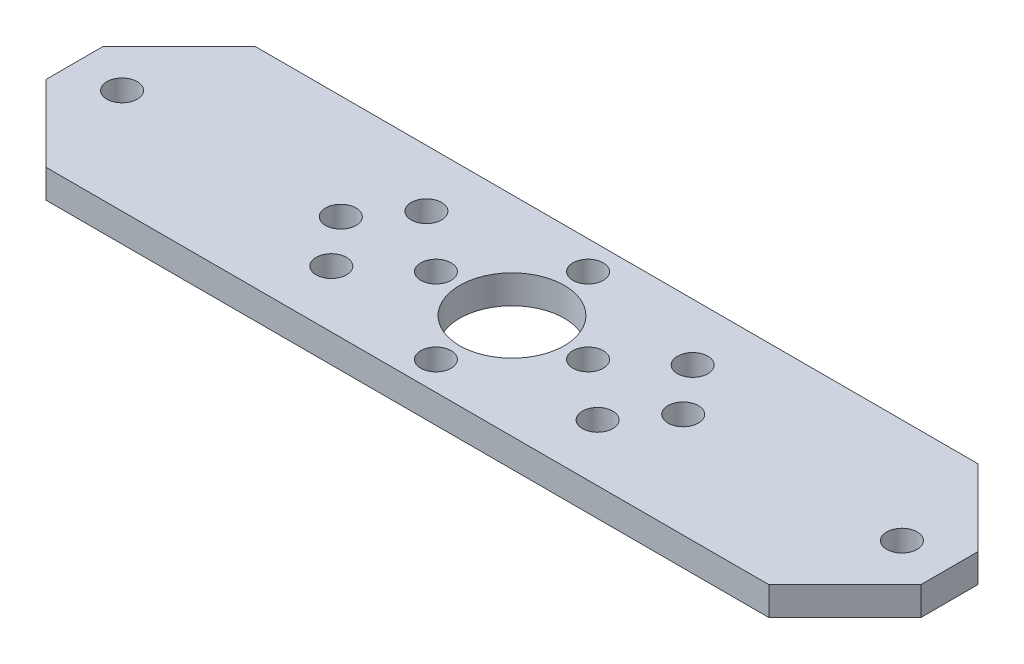
ISO-10303-21;
HEADER;
FILE_DESCRIPTION(('STEP AP214'),'2;1');
FILE_NAME('part.step','',(''),(''),'','','');
FILE_SCHEMA(('AUTOMOTIVE_DESIGN { 1 0 10303 214 1 1 1 1 }'));
ENDSEC;
DATA;
#1=APPLICATION_CONTEXT('core data for automotive mechanical design processes');
#2=APPLICATION_PROTOCOL_DEFINITION('international standard','automotive_design',2000,#1);
#3=PRODUCT_CONTEXT('',#1,'mechanical');
#4=PRODUCT('Part','Part','',(#3));
#5=PRODUCT_RELATED_PRODUCT_CATEGORY('part','',(#4));
#6=PRODUCT_DEFINITION_FORMATION('','',#4);
#7=PRODUCT_DEFINITION_CONTEXT('part definition',#1,'design');
#8=PRODUCT_DEFINITION('design','',#6,#7);
#9=PRODUCT_DEFINITION_SHAPE('','',#8);
#10=(LENGTH_UNIT() NAMED_UNIT(*) SI_UNIT(.MILLI.,.METRE.));
#11=(NAMED_UNIT(*) PLANE_ANGLE_UNIT() SI_UNIT($,.RADIAN.));
#12=(NAMED_UNIT(*) SI_UNIT($,.STERADIAN.) SOLID_ANGLE_UNIT());
#13=UNCERTAINTY_MEASURE_WITH_UNIT(LENGTH_MEASURE(1.E-05),#10,'distance_accuracy_value','');
#14=(GEOMETRIC_REPRESENTATION_CONTEXT(3) GLOBAL_UNCERTAINTY_ASSIGNED_CONTEXT((#13)) GLOBAL_UNIT_ASSIGNED_CONTEXT((#10,
#11,#12)) REPRESENTATION_CONTEXT('',''));
#15=CARTESIAN_POINT('',(0.,0.,0.));
#16=DIRECTION('',(0.,0.,1.));
#17=DIRECTION('',(1.,0.,0.));
#18=AXIS2_PLACEMENT_3D('',#15,#16,#17);
#19=CARTESIAN_POINT('',(0.,3.,0.));
#20=DIRECTION('',(0.,-1.,0.));
#21=DIRECTION('',(0.,0.,-1.));
#22=AXIS2_PLACEMENT_3D('',#19,#20,#21);
#23=PLANE('',#22);
#24=DIRECTION('',(0.,0.,1.));
#25=VECTOR('',#24,1.);
#26=CARTESIAN_POINT('',(-46.,3.,3.));
#27=LINE('',#26,#25);
#28=CARTESIAN_POINT('',(-46.,3.,-3.));
#29=VERTEX_POINT('',#28);
#30=CARTESIAN_POINT('',(-46.,3.,3.));
#31=VERTEX_POINT('',#30);
#32=EDGE_CURVE('E172',#29,#31,#27,.T.);
#33=ORIENTED_EDGE('',*,*,#32,.T.);
#34=DIRECTION('',(0.707106781186548,0.,0.707106781186548));
#35=VECTOR('',#34,1.);
#36=CARTESIAN_POINT('',(-46.,3.,3.));
#37=LINE('',#36,#35);
#38=CARTESIAN_POINT('',(-38.,3.,11.));
#39=VERTEX_POINT('',#38);
#40=EDGE_CURVE('E106',#31,#39,#37,.T.);
#41=ORIENTED_EDGE('',*,*,#40,.T.);
#42=DIRECTION('',(1.,0.,0.));
#43=VECTOR('',#42,1.);
#44=CARTESIAN_POINT('',(-38.,3.,11.));
#45=LINE('',#44,#43);
#46=CARTESIAN_POINT('',(38.,3.,11.));
#47=VERTEX_POINT('',#46);
#48=EDGE_CURVE('E194',#39,#47,#45,.T.);
#49=ORIENTED_EDGE('',*,*,#48,.T.);
#50=DIRECTION('',(0.707106781186548,0.,-0.707106781186548));
#51=VECTOR('',#50,1.);
#52=CARTESIAN_POINT('',(38.,3.,11.));
#53=LINE('',#52,#51);
#54=CARTESIAN_POINT('',(46.,3.,3.));
#55=VERTEX_POINT('',#54);
#56=EDGE_CURVE('E208',#47,#55,#53,.T.);
#57=ORIENTED_EDGE('',*,*,#56,.T.);
#58=DIRECTION('',(0.,0.,-1.));
#59=VECTOR('',#58,1.);
#60=CARTESIAN_POINT('',(46.,3.,3.));
#61=LINE('',#60,#59);
#62=CARTESIAN_POINT('',(46.,3.,-3.));
#63=VERTEX_POINT('',#62);
#64=EDGE_CURVE('E125',#55,#63,#61,.T.);
#65=ORIENTED_EDGE('',*,*,#64,.T.);
#66=DIRECTION('',(-0.707106781186548,0.,-0.707106781186548));
#67=VECTOR('',#66,1.);
#68=CARTESIAN_POINT('',(38.,3.,-11.));
#69=LINE('',#68,#67);
#70=CARTESIAN_POINT('',(38.,3.,-11.));
#71=VERTEX_POINT('',#70);
#72=EDGE_CURVE('E119',#63,#71,#69,.T.);
#73=ORIENTED_EDGE('',*,*,#72,.T.);
#74=DIRECTION('',(-1.,0.,0.));
#75=VECTOR('',#74,1.);
#76=CARTESIAN_POINT('',(-38.,3.,-11.));
#77=LINE('',#76,#75);
#78=CARTESIAN_POINT('',(-38.,3.,-11.));
#79=VERTEX_POINT('',#78);
#80=EDGE_CURVE('E123',#71,#79,#77,.T.);
#81=ORIENTED_EDGE('',*,*,#80,.T.);
#82=DIRECTION('',(-0.707106781186548,0.,0.707106781186548));
#83=VECTOR('',#82,1.);
#84=CARTESIAN_POINT('',(-46.,3.,-3.));
#85=LINE('',#84,#83);
#86=EDGE_CURVE('E63',#79,#29,#85,.T.);
#87=ORIENTED_EDGE('',*,*,#86,.T.);
#88=EDGE_LOOP('',(#33,#41,#49,#57,#65,#73,#81,#87));
#89=FACE_BOUND('',#88,.T.);
#90=CARTESIAN_POINT('',(0.,3.,8.));
#91=DIRECTION('',(0.,1.,0.));
#92=DIRECTION('',(0.,0.,-1.));
#93=AXIS2_PLACEMENT_3D('',#90,#91,#92);
#94=CIRCLE('',#93,1.6);
#95=CARTESIAN_POINT('',(0.,3.,6.4));
#96=VERTEX_POINT('',#95);
#97=EDGE_CURVE('E154',#96,#96,#94,.T.);
#98=ORIENTED_EDGE('',*,*,#97,.F.);
#99=EDGE_LOOP('',(#98));
#100=FACE_BOUND('',#99,.T.);
#101=CARTESIAN_POINT('',(0.,3.,-8.));
#102=DIRECTION('',(0.,1.,0.));
#103=DIRECTION('',(0.,0.,1.));
#104=AXIS2_PLACEMENT_3D('',#101,#102,#103);
#105=CIRCLE('',#104,1.6);
#106=CARTESIAN_POINT('',(0.,3.,-6.4));
#107=VERTEX_POINT('',#106);
#108=EDGE_CURVE('E223',#107,#107,#105,.T.);
#109=ORIENTED_EDGE('',*,*,#108,.F.);
#110=EDGE_LOOP('',(#109));
#111=FACE_BOUND('',#110,.T.);
#112=CARTESIAN_POINT('',(8.,3.,0.));
#113=DIRECTION('',(0.,1.,0.));
#114=DIRECTION('',(0.,0.,1.));
#115=AXIS2_PLACEMENT_3D('',#112,#113,#114);
#116=CIRCLE('',#115,1.6);
#117=CARTESIAN_POINT('',(8.,3.,1.6));
#118=VERTEX_POINT('',#117);
#119=EDGE_CURVE('E231',#118,#118,#116,.T.);
#120=ORIENTED_EDGE('',*,*,#119,.F.);
#121=EDGE_LOOP('',(#120));
#122=FACE_BOUND('',#121,.T.);
#123=CARTESIAN_POINT('',(-8.,3.,0.));
#124=DIRECTION('',(0.,1.,0.));
#125=DIRECTION('',(0.,0.,-1.));
#126=AXIS2_PLACEMENT_3D('',#123,#124,#125);
#127=CIRCLE('',#126,1.6);
#128=CARTESIAN_POINT('',(-8.,3.,-1.6));
#129=VERTEX_POINT('',#128);
#130=EDGE_CURVE('E238',#129,#129,#127,.T.);
#131=ORIENTED_EDGE('',*,*,#130,.F.);
#132=EDGE_LOOP('',(#131));
#133=FACE_BOUND('',#132,.T.);
#134=CARTESIAN_POINT('',(-18.,3.,0.));
#135=DIRECTION('',(0.,1.,0.));
#136=DIRECTION('',(0.,0.,1.));
#137=AXIS2_PLACEMENT_3D('',#134,#135,#136);
#138=CIRCLE('',#137,1.60000000000001);
#139=CARTESIAN_POINT('',(-18.,3.,1.60000000000001));
#140=VERTEX_POINT('',#139);
#141=EDGE_CURVE('E245',#140,#140,#138,.T.);
#142=ORIENTED_EDGE('',*,*,#141,.F.);
#143=EDGE_LOOP('',(#142));
#144=FACE_BOUND('',#143,.T.);
#145=CARTESIAN_POINT('',(-14.,3.,-5.));
#146=DIRECTION('',(0.,1.,0.));
#147=DIRECTION('',(0.,0.,1.));
#148=AXIS2_PLACEMENT_3D('',#145,#146,#147);
#149=CIRCLE('',#148,1.6);
#150=CARTESIAN_POINT('',(-14.,3.,-3.4));
#151=VERTEX_POINT('',#150);
#152=EDGE_CURVE('E253',#151,#151,#149,.T.);
#153=ORIENTED_EDGE('',*,*,#152,.F.);
#154=EDGE_LOOP('',(#153));
#155=FACE_BOUND('',#154,.T.);
#156=CARTESIAN_POINT('',(-14.,3.,5.));
#157=DIRECTION('',(0.,1.,0.));
#158=DIRECTION('',(0.,0.,-1.));
#159=AXIS2_PLACEMENT_3D('',#156,#157,#158);
#160=CIRCLE('',#159,1.6);
#161=CARTESIAN_POINT('',(-14.,3.,3.4));
#162=VERTEX_POINT('',#161);
#163=EDGE_CURVE('E261',#162,#162,#160,.T.);
#164=ORIENTED_EDGE('',*,*,#163,.F.);
#165=EDGE_LOOP('',(#164));
#166=FACE_BOUND('',#165,.T.);
#167=CARTESIAN_POINT('',(14.,3.,5.));
#168=DIRECTION('',(0.,1.,0.));
#169=DIRECTION('',(0.,0.,1.));
#170=AXIS2_PLACEMENT_3D('',#167,#168,#169);
#171=CIRCLE('',#170,1.60000000000001);
#172=CARTESIAN_POINT('',(14.,3.,6.6));
#173=VERTEX_POINT('',#172);
#174=EDGE_CURVE('E269',#173,#173,#171,.T.);
#175=ORIENTED_EDGE('',*,*,#174,.F.);
#176=EDGE_LOOP('',(#175));
#177=FACE_BOUND('',#176,.T.);
#178=CARTESIAN_POINT('',(18.,3.,0.));
#179=DIRECTION('',(0.,1.,0.));
#180=DIRECTION('',(0.,0.,-1.));
#181=AXIS2_PLACEMENT_3D('',#178,#179,#180);
#182=CIRCLE('',#181,1.60000000000001);
#183=CARTESIAN_POINT('',(18.,3.,-1.60000000000001));
#184=VERTEX_POINT('',#183);
#185=EDGE_CURVE('E277',#184,#184,#182,.T.);
#186=ORIENTED_EDGE('',*,*,#185,.F.);
#187=EDGE_LOOP('',(#186));
#188=FACE_BOUND('',#187,.T.);
#189=CARTESIAN_POINT('',(14.,3.,-5.));
#190=DIRECTION('',(0.,1.,0.));
#191=DIRECTION('',(0.,0.,-1.));
#192=AXIS2_PLACEMENT_3D('',#189,#190,#191);
#193=CIRCLE('',#192,1.60000000000001);
#194=CARTESIAN_POINT('',(14.,3.,-6.6));
#195=VERTEX_POINT('',#194);
#196=EDGE_CURVE('E284',#195,#195,#193,.T.);
#197=ORIENTED_EDGE('',*,*,#196,.F.);
#198=EDGE_LOOP('',(#197));
#199=FACE_BOUND('',#198,.T.);
#200=CARTESIAN_POINT('',(-41.,3.,0.));
#201=DIRECTION('',(0.,1.,0.));
#202=DIRECTION('',(0.,0.,1.));
#203=AXIS2_PLACEMENT_3D('',#200,#201,#202);
#204=CIRCLE('',#203,1.6);
#205=CARTESIAN_POINT('',(-41.,3.,1.6));
#206=VERTEX_POINT('',#205);
#207=EDGE_CURVE('E291',#206,#206,#204,.T.);
#208=ORIENTED_EDGE('',*,*,#207,.F.);
#209=EDGE_LOOP('',(#208));
#210=FACE_BOUND('',#209,.T.);
#211=CARTESIAN_POINT('',(41.,3.,0.));
#212=DIRECTION('',(0.,1.,0.));
#213=DIRECTION('',(0.,0.,-1.));
#214=AXIS2_PLACEMENT_3D('',#211,#212,#213);
#215=CIRCLE('',#214,1.6);
#216=CARTESIAN_POINT('',(41.,3.,-1.6));
#217=VERTEX_POINT('',#216);
#218=EDGE_CURVE('E299',#217,#217,#215,.T.);
#219=ORIENTED_EDGE('',*,*,#218,.F.);
#220=EDGE_LOOP('',(#219));
#221=FACE_BOUND('',#220,.T.);
#222=CARTESIAN_POINT('',(0.,3.,0.));
#223=DIRECTION('',(0.,1.,0.));
#224=DIRECTION('',(0.,0.,1.));
#225=AXIS2_PLACEMENT_3D('',#222,#223,#224);
#226=CIRCLE('',#225,5.5);
#227=CARTESIAN_POINT('',(0.,3.,5.5));
#228=VERTEX_POINT('',#227);
#229=EDGE_CURVE('E307',#228,#228,#226,.T.);
#230=ORIENTED_EDGE('',*,*,#229,.F.);
#231=EDGE_LOOP('',(#230));
#232=FACE_BOUND('',#231,.T.);
#233=ADVANCED_FACE('F45',(#89,#100,#111,#122,#133,#144,#155,#166,#177,#188,#199,#210,#221,#232),
#23,.F.);
#234=CARTESIAN_POINT('',(0.,0.,0.));
#235=DIRECTION('',(0.,-1.,0.));
#236=DIRECTION('',(0.,0.,-1.));
#237=AXIS2_PLACEMENT_3D('',#234,#235,#236);
#238=PLANE('',#237);
#239=CARTESIAN_POINT('',(41.,0.,0.));
#240=DIRECTION('',(0.,1.,0.));
#241=DIRECTION('',(0.,0.,-1.));
#242=AXIS2_PLACEMENT_3D('',#239,#240,#241);
#243=CIRCLE('',#242,1.6);
#244=CARTESIAN_POINT('',(41.,0.,-1.6));
#245=VERTEX_POINT('',#244);
#246=EDGE_CURVE('E303',#245,#245,#243,.T.);
#247=ORIENTED_EDGE('',*,*,#246,.T.);
#248=EDGE_LOOP('',(#247));
#249=FACE_BOUND('',#248,.T.);
#250=CARTESIAN_POINT('',(14.,0.,-5.));
#251=DIRECTION('',(0.,1.,0.));
#252=DIRECTION('',(0.,0.,-1.));
#253=AXIS2_PLACEMENT_3D('',#250,#251,#252);
#254=CIRCLE('',#253,1.60000000000001);
#255=CARTESIAN_POINT('',(14.,0.,-6.6));
#256=VERTEX_POINT('',#255);
#257=EDGE_CURVE('E288',#256,#256,#254,.T.);
#258=ORIENTED_EDGE('',*,*,#257,.T.);
#259=EDGE_LOOP('',(#258));
#260=FACE_BOUND('',#259,.T.);
#261=CARTESIAN_POINT('',(14.,0.,5.));
#262=DIRECTION('',(0.,1.,0.));
#263=DIRECTION('',(0.,0.,1.));
#264=AXIS2_PLACEMENT_3D('',#261,#262,#263);
#265=CIRCLE('',#264,1.60000000000001);
#266=CARTESIAN_POINT('',(14.,0.,6.6));
#267=VERTEX_POINT('',#266);
#268=EDGE_CURVE('E273',#267,#267,#265,.T.);
#269=ORIENTED_EDGE('',*,*,#268,.T.);
#270=EDGE_LOOP('',(#269));
#271=FACE_BOUND('',#270,.T.);
#272=CARTESIAN_POINT('',(-14.,0.,-5.));
#273=DIRECTION('',(0.,1.,0.));
#274=DIRECTION('',(0.,0.,1.));
#275=AXIS2_PLACEMENT_3D('',#272,#273,#274);
#276=CIRCLE('',#275,1.6);
#277=CARTESIAN_POINT('',(-14.,0.,-3.4));
#278=VERTEX_POINT('',#277);
#279=EDGE_CURVE('E257',#278,#278,#276,.T.);
#280=ORIENTED_EDGE('',*,*,#279,.T.);
#281=EDGE_LOOP('',(#280));
#282=FACE_BOUND('',#281,.T.);
#283=CARTESIAN_POINT('',(-8.,0.,0.));
#284=DIRECTION('',(0.,1.,0.));
#285=DIRECTION('',(0.,0.,-1.));
#286=AXIS2_PLACEMENT_3D('',#283,#284,#285);
#287=CIRCLE('',#286,1.6);
#288=CARTESIAN_POINT('',(-8.,0.,-1.6));
#289=VERTEX_POINT('',#288);
#290=EDGE_CURVE('E241',#289,#289,#287,.T.);
#291=ORIENTED_EDGE('',*,*,#290,.T.);
#292=EDGE_LOOP('',(#291));
#293=FACE_BOUND('',#292,.T.);
#294=CARTESIAN_POINT('',(0.,0.,-8.));
#295=DIRECTION('',(0.,1.,0.));
#296=DIRECTION('',(0.,0.,1.));
#297=AXIS2_PLACEMENT_3D('',#294,#295,#296);
#298=CIRCLE('',#297,1.6);
#299=CARTESIAN_POINT('',(0.,0.,-6.4));
#300=VERTEX_POINT('',#299);
#301=EDGE_CURVE('E227',#300,#300,#298,.T.);
#302=ORIENTED_EDGE('',*,*,#301,.T.);
#303=EDGE_LOOP('',(#302));
#304=FACE_BOUND('',#303,.T.);
#305=DIRECTION('',(0.,0.,1.));
#306=VECTOR('',#305,1.);
#307=CARTESIAN_POINT('',(-46.,0.,3.));
#308=LINE('',#307,#306);
#309=CARTESIAN_POINT('',(-46.,0.,-3.));
#310=VERTEX_POINT('',#309);
#311=CARTESIAN_POINT('',(-46.,0.,3.));
#312=VERTEX_POINT('',#311);
#313=EDGE_CURVE('E149',#310,#312,#308,.T.);
#314=ORIENTED_EDGE('',*,*,#313,.F.);
#315=DIRECTION('',(-0.707106781186548,0.,0.707106781186548));
#316=VECTOR('',#315,1.);
#317=CARTESIAN_POINT('',(-46.,0.,-3.));
#318=LINE('',#317,#316);
#319=CARTESIAN_POINT('',(-38.,0.,-11.));
#320=VERTEX_POINT('',#319);
#321=EDGE_CURVE('E98',#320,#310,#318,.T.);
#322=ORIENTED_EDGE('',*,*,#321,.F.);
#323=DIRECTION('',(-1.,0.,0.));
#324=VECTOR('',#323,1.);
#325=CARTESIAN_POINT('',(-38.,0.,-11.));
#326=LINE('',#325,#324);
#327=CARTESIAN_POINT('',(38.,0.,-11.));
#328=VERTEX_POINT('',#327);
#329=EDGE_CURVE('E92',#328,#320,#326,.T.);
#330=ORIENTED_EDGE('',*,*,#329,.F.);
#331=DIRECTION('',(-0.707106781186548,0.,-0.707106781186548));
#332=VECTOR('',#331,1.);
#333=CARTESIAN_POINT('',(38.,0.,-11.));
#334=LINE('',#333,#332);
#335=CARTESIAN_POINT('',(46.,0.,-3.));
#336=VERTEX_POINT('',#335);
#337=EDGE_CURVE('E134',#336,#328,#334,.T.);
#338=ORIENTED_EDGE('',*,*,#337,.F.);
#339=DIRECTION('',(0.,0.,-1.));
#340=VECTOR('',#339,1.);
#341=CARTESIAN_POINT('',(46.,0.,3.));
#342=LINE('',#341,#340);
#343=CARTESIAN_POINT('',(46.,0.,3.));
#344=VERTEX_POINT('',#343);
#345=EDGE_CURVE('E163',#344,#336,#342,.T.);
#346=ORIENTED_EDGE('',*,*,#345,.F.);
#347=DIRECTION('',(0.707106781186548,0.,-0.707106781186548));
#348=VECTOR('',#347,1.);
#349=CARTESIAN_POINT('',(38.,0.,11.));
#350=LINE('',#349,#348);
#351=CARTESIAN_POINT('',(38.,0.,11.));
#352=VERTEX_POINT('',#351);
#353=EDGE_CURVE('E160',#352,#344,#350,.T.);
#354=ORIENTED_EDGE('',*,*,#353,.F.);
#355=DIRECTION('',(1.,0.,0.));
#356=VECTOR('',#355,1.);
#357=CARTESIAN_POINT('',(-38.,0.,11.));
#358=LINE('',#357,#356);
#359=CARTESIAN_POINT('',(-38.,0.,11.));
#360=VERTEX_POINT('',#359);
#361=EDGE_CURVE('E157',#360,#352,#358,.T.);
#362=ORIENTED_EDGE('',*,*,#361,.F.);
#363=DIRECTION('',(0.707106781186548,0.,0.707106781186548));
#364=VECTOR('',#363,1.);
#365=CARTESIAN_POINT('',(-46.,0.,3.));
#366=LINE('',#365,#364);
#367=EDGE_CURVE('E153',#312,#360,#366,.T.);
#368=ORIENTED_EDGE('',*,*,#367,.F.);
#369=EDGE_LOOP('',(#314,#322,#330,#338,#346,#354,#362,#368));
#370=FACE_BOUND('',#369,.T.);
#371=CARTESIAN_POINT('',(0.,0.,8.));
#372=DIRECTION('',(0.,1.,0.));
#373=DIRECTION('',(0.,0.,-1.));
#374=AXIS2_PLACEMENT_3D('',#371,#372,#373);
#375=CIRCLE('',#374,1.6);
#376=CARTESIAN_POINT('',(0.,0.,6.4));
#377=VERTEX_POINT('',#376);
#378=EDGE_CURVE('E219',#377,#377,#375,.T.);
#379=ORIENTED_EDGE('',*,*,#378,.T.);
#380=EDGE_LOOP('',(#379));
#381=FACE_BOUND('',#380,.T.);
#382=CARTESIAN_POINT('',(8.,0.,0.));
#383=DIRECTION('',(0.,1.,0.));
#384=DIRECTION('',(0.,0.,1.));
#385=AXIS2_PLACEMENT_3D('',#382,#383,#384);
#386=CIRCLE('',#385,1.6);
#387=CARTESIAN_POINT('',(8.,0.,1.6));
#388=VERTEX_POINT('',#387);
#389=EDGE_CURVE('E235',#388,#388,#386,.T.);
#390=ORIENTED_EDGE('',*,*,#389,.T.);
#391=EDGE_LOOP('',(#390));
#392=FACE_BOUND('',#391,.T.);
#393=CARTESIAN_POINT('',(-18.,0.,0.));
#394=DIRECTION('',(0.,1.,0.));
#395=DIRECTION('',(0.,0.,1.));
#396=AXIS2_PLACEMENT_3D('',#393,#394,#395);
#397=CIRCLE('',#396,1.60000000000001);
#398=CARTESIAN_POINT('',(-18.,0.,1.60000000000001));
#399=VERTEX_POINT('',#398);
#400=EDGE_CURVE('E249',#399,#399,#397,.T.);
#401=ORIENTED_EDGE('',*,*,#400,.T.);
#402=EDGE_LOOP('',(#401));
#403=FACE_BOUND('',#402,.T.);
#404=CARTESIAN_POINT('',(-14.,0.,5.));
#405=DIRECTION('',(0.,1.,0.));
#406=DIRECTION('',(0.,0.,-1.));
#407=AXIS2_PLACEMENT_3D('',#404,#405,#406);
#408=CIRCLE('',#407,1.6);
#409=CARTESIAN_POINT('',(-14.,0.,3.4));
#410=VERTEX_POINT('',#409);
#411=EDGE_CURVE('E265',#410,#410,#408,.T.);
#412=ORIENTED_EDGE('',*,*,#411,.T.);
#413=EDGE_LOOP('',(#412));
#414=FACE_BOUND('',#413,.T.);
#415=CARTESIAN_POINT('',(18.,0.,0.));
#416=DIRECTION('',(0.,1.,0.));
#417=DIRECTION('',(0.,0.,-1.));
#418=AXIS2_PLACEMENT_3D('',#415,#416,#417);
#419=CIRCLE('',#418,1.60000000000001);
#420=CARTESIAN_POINT('',(18.,0.,-1.60000000000001));
#421=VERTEX_POINT('',#420);
#422=EDGE_CURVE('E280',#421,#421,#419,.T.);
#423=ORIENTED_EDGE('',*,*,#422,.T.);
#424=EDGE_LOOP('',(#423));
#425=FACE_BOUND('',#424,.T.);
#426=CARTESIAN_POINT('',(-41.,0.,0.));
#427=DIRECTION('',(0.,1.,0.));
#428=DIRECTION('',(0.,0.,1.));
#429=AXIS2_PLACEMENT_3D('',#426,#427,#428);
#430=CIRCLE('',#429,1.6);
#431=CARTESIAN_POINT('',(-41.,0.,1.6));
#432=VERTEX_POINT('',#431);
#433=EDGE_CURVE('E295',#432,#432,#430,.T.);
#434=ORIENTED_EDGE('',*,*,#433,.T.);
#435=EDGE_LOOP('',(#434));
#436=FACE_BOUND('',#435,.T.);
#437=CARTESIAN_POINT('',(0.,0.,0.));
#438=DIRECTION('',(0.,1.,0.));
#439=DIRECTION('',(0.,0.,1.));
#440=AXIS2_PLACEMENT_3D('',#437,#438,#439);
#441=CIRCLE('',#440,5.5);
#442=CARTESIAN_POINT('',(0.,0.,5.5));
#443=VERTEX_POINT('',#442);
#444=EDGE_CURVE('E311',#443,#443,#441,.T.);
#445=ORIENTED_EDGE('',*,*,#444,.T.);
#446=EDGE_LOOP('',(#445));
#447=FACE_BOUND('',#446,.T.);
#448=ADVANCED_FACE('F198',(#249,#260,#271,#282,#293,#304,#370,#381,#392,#403,#414,#425,#436,
#447),#238,.T.);
#449=CARTESIAN_POINT('',(-46.,3.,3.));
#450=DIRECTION('',(1.,0.,0.));
#451=DIRECTION('',(0.,0.,-1.));
#452=AXIS2_PLACEMENT_3D('',#449,#450,#451);
#453=PLANE('',#452);
#454=ORIENTED_EDGE('',*,*,#313,.T.);
#455=DIRECTION('',(0.,-1.,0.));
#456=VECTOR('',#455,1.);
#457=CARTESIAN_POINT('',(-46.,3.,3.));
#458=LINE('',#457,#456);
#459=EDGE_CURVE('E11',#31,#312,#458,.T.);
#460=ORIENTED_EDGE('',*,*,#459,.F.);
#461=ORIENTED_EDGE('',*,*,#32,.F.);
#462=DIRECTION('',(0.,-1.,0.));
#463=VECTOR('',#462,1.);
#464=CARTESIAN_POINT('',(-46.,3.,-3.));
#465=LINE('',#464,#463);
#466=EDGE_CURVE('E145',#29,#310,#465,.T.);
#467=ORIENTED_EDGE('',*,*,#466,.T.);
#468=EDGE_LOOP('',(#454,#460,#461,#467));
#469=FACE_BOUND('',#468,.T.);
#470=ADVANCED_FACE('F47',(#469),#453,.F.);
#471=CARTESIAN_POINT('',(-46.,3.,3.));
#472=DIRECTION('',(0.707106781186547,0.,-0.707106781186547));
#473=DIRECTION('',(-0.707106781186548,0.,-0.707106781186548));
#474=AXIS2_PLACEMENT_3D('',#471,#472,#473);
#475=PLANE('',#474);
#476=ORIENTED_EDGE('',*,*,#367,.T.);
#477=DIRECTION('',(0.,-1.,0.));
#478=VECTOR('',#477,1.);
#479=CARTESIAN_POINT('',(-38.,3.,11.));
#480=LINE('',#479,#478);
#481=EDGE_CURVE('E55',#39,#360,#480,.T.);
#482=ORIENTED_EDGE('',*,*,#481,.F.);
#483=ORIENTED_EDGE('',*,*,#40,.F.);
#484=ORIENTED_EDGE('',*,*,#459,.T.);
#485=EDGE_LOOP('',(#476,#482,#483,#484));
#486=FACE_BOUND('',#485,.T.);
#487=ADVANCED_FACE('F344',(#486),#475,.F.);
#488=CARTESIAN_POINT('',(-38.,3.,11.));
#489=DIRECTION('',(0.,0.,-1.));
#490=DIRECTION('',(-1.,0.,0.));
#491=AXIS2_PLACEMENT_3D('',#488,#489,#490);
#492=PLANE('',#491);
#493=ORIENTED_EDGE('',*,*,#361,.T.);
#494=DIRECTION('',(0.,-1.,0.));
#495=VECTOR('',#494,1.);
#496=CARTESIAN_POINT('',(38.,3.,11.));
#497=LINE('',#496,#495);
#498=EDGE_CURVE('E182',#47,#352,#497,.T.);
#499=ORIENTED_EDGE('',*,*,#498,.F.);
#500=ORIENTED_EDGE('',*,*,#48,.F.);
#501=ORIENTED_EDGE('',*,*,#481,.T.);
#502=EDGE_LOOP('',(#493,#499,#500,#501));
#503=FACE_BOUND('',#502,.T.);
#504=ADVANCED_FACE('F192',(#503),#492,.F.);
#505=CARTESIAN_POINT('',(38.,3.,11.));
#506=DIRECTION('',(-0.707106781186547,0.,-0.707106781186547));
#507=DIRECTION('',(-0.707106781186548,0.,0.707106781186548));
#508=AXIS2_PLACEMENT_3D('',#505,#506,#507);
#509=PLANE('',#508);
#510=ORIENTED_EDGE('',*,*,#353,.T.);
#511=DIRECTION('',(0.,-1.,0.));
#512=VECTOR('',#511,1.);
#513=CARTESIAN_POINT('',(46.,3.,3.));
#514=LINE('',#513,#512);
#515=EDGE_CURVE('E178',#55,#344,#514,.T.);
#516=ORIENTED_EDGE('',*,*,#515,.F.);
#517=ORIENTED_EDGE('',*,*,#56,.F.);
#518=ORIENTED_EDGE('',*,*,#498,.T.);
#519=EDGE_LOOP('',(#510,#516,#517,#518));
#520=FACE_BOUND('',#519,.T.);
#521=ADVANCED_FACE('F203',(#520),#509,.F.);
#522=CARTESIAN_POINT('',(46.,3.,3.));
#523=DIRECTION('',(-1.,0.,0.));
#524=DIRECTION('',(0.,0.,1.));
#525=AXIS2_PLACEMENT_3D('',#522,#523,#524);
#526=PLANE('',#525);
#527=ORIENTED_EDGE('',*,*,#345,.T.);
#528=DIRECTION('',(0.,-1.,0.));
#529=VECTOR('',#528,1.);
#530=CARTESIAN_POINT('',(46.,3.,-3.));
#531=LINE('',#530,#529);
#532=EDGE_CURVE('E136',#63,#336,#531,.T.);
#533=ORIENTED_EDGE('',*,*,#532,.F.);
#534=ORIENTED_EDGE('',*,*,#64,.F.);
#535=ORIENTED_EDGE('',*,*,#515,.T.);
#536=EDGE_LOOP('',(#527,#533,#534,#535));
#537=FACE_BOUND('',#536,.T.);
#538=ADVANCED_FACE('F206',(#537),#526,.F.);
#539=CARTESIAN_POINT('',(38.,3.,-11.));
#540=DIRECTION('',(-0.707106781186547,0.,0.707106781186547));
#541=DIRECTION('',(0.707106781186548,0.,0.707106781186548));
#542=AXIS2_PLACEMENT_3D('',#539,#540,#541);
#543=PLANE('',#542);
#544=ORIENTED_EDGE('',*,*,#337,.T.);
#545=DIRECTION('',(0.,-1.,0.));
#546=VECTOR('',#545,1.);
#547=CARTESIAN_POINT('',(38.,3.,-11.));
#548=LINE('',#547,#546);
#549=EDGE_CURVE('E131',#71,#328,#548,.T.);
#550=ORIENTED_EDGE('',*,*,#549,.F.);
#551=ORIENTED_EDGE('',*,*,#72,.F.);
#552=ORIENTED_EDGE('',*,*,#532,.T.);
#553=EDGE_LOOP('',(#544,#550,#551,#552));
#554=FACE_BOUND('',#553,.T.);
#555=ADVANCED_FACE('F132',(#554),#543,.F.);
#556=CARTESIAN_POINT('',(-38.,3.,-11.));
#557=DIRECTION('',(0.,0.,1.));
#558=DIRECTION('',(1.,0.,0.));
#559=AXIS2_PLACEMENT_3D('',#556,#557,#558);
#560=PLANE('',#559);
#561=ORIENTED_EDGE('',*,*,#329,.T.);
#562=DIRECTION('',(0.,-1.,0.));
#563=VECTOR('',#562,1.);
#564=CARTESIAN_POINT('',(-38.,3.,-11.));
#565=LINE('',#564,#563);
#566=EDGE_CURVE('E137',#79,#320,#565,.T.);
#567=ORIENTED_EDGE('',*,*,#566,.F.);
#568=ORIENTED_EDGE('',*,*,#80,.F.);
#569=ORIENTED_EDGE('',*,*,#549,.T.);
#570=EDGE_LOOP('',(#561,#567,#568,#569));
#571=FACE_BOUND('',#570,.T.);
#572=ADVANCED_FACE('F139',(#571),#560,.F.);
#573=CARTESIAN_POINT('',(-46.,3.,-3.));
#574=DIRECTION('',(0.707106781186547,0.,0.707106781186547));
#575=DIRECTION('',(0.707106781186548,0.,-0.707106781186548));
#576=AXIS2_PLACEMENT_3D('',#573,#574,#575);
#577=PLANE('',#576);
#578=ORIENTED_EDGE('',*,*,#321,.T.);
#579=ORIENTED_EDGE('',*,*,#466,.F.);
#580=ORIENTED_EDGE('',*,*,#86,.F.);
#581=ORIENTED_EDGE('',*,*,#566,.T.);
#582=EDGE_LOOP('',(#578,#579,#580,#581));
#583=FACE_BOUND('',#582,.T.);
#584=ADVANCED_FACE('F332',(#583),#577,.F.);
#585=CARTESIAN_POINT('',(0.,3.,8.));
#586=DIRECTION('',(0.,-1.,0.));
#587=DIRECTION('',(0.,0.,-1.));
#588=AXIS2_PLACEMENT_3D('',#585,#586,#587);
#589=CYLINDRICAL_SURFACE('',#588,1.6);
#590=ORIENTED_EDGE('',*,*,#97,.T.);
#591=EDGE_LOOP('',(#590));
#592=FACE_BOUND('',#591,.T.);
#593=ORIENTED_EDGE('',*,*,#378,.F.);
#594=EDGE_LOOP('',(#593));
#595=FACE_BOUND('',#594,.T.);
#596=ADVANCED_FACE('F329',(#592,#595),#589,.F.);
#597=CARTESIAN_POINT('',(0.,3.,-8.));
#598=DIRECTION('',(0.,-1.,0.));
#599=DIRECTION('',(0.,0.,-1.));
#600=AXIS2_PLACEMENT_3D('',#597,#598,#599);
#601=CYLINDRICAL_SURFACE('',#600,1.6);
#602=ORIENTED_EDGE('',*,*,#108,.T.);
#603=EDGE_LOOP('',(#602));
#604=FACE_BOUND('',#603,.T.);
#605=ORIENTED_EDGE('',*,*,#301,.F.);
#606=EDGE_LOOP('',(#605));
#607=FACE_BOUND('',#606,.T.);
#608=ADVANCED_FACE('F405',(#604,#607),#601,.F.);
#609=CARTESIAN_POINT('',(8.,3.,0.));
#610=DIRECTION('',(0.,-1.,0.));
#611=DIRECTION('',(0.,0.,-1.));
#612=AXIS2_PLACEMENT_3D('',#609,#610,#611);
#613=CYLINDRICAL_SURFACE('',#612,1.6);
#614=ORIENTED_EDGE('',*,*,#119,.T.);
#615=EDGE_LOOP('',(#614));
#616=FACE_BOUND('',#615,.T.);
#617=ORIENTED_EDGE('',*,*,#389,.F.);
#618=EDGE_LOOP('',(#617));
#619=FACE_BOUND('',#618,.T.);
#620=ADVANCED_FACE('F413',(#616,#619),#613,.F.);
#621=CARTESIAN_POINT('',(-8.,3.,0.));
#622=DIRECTION('',(0.,-1.,0.));
#623=DIRECTION('',(0.,0.,-1.));
#624=AXIS2_PLACEMENT_3D('',#621,#622,#623);
#625=CYLINDRICAL_SURFACE('',#624,1.6);
#626=ORIENTED_EDGE('',*,*,#130,.T.);
#627=EDGE_LOOP('',(#626));
#628=FACE_BOUND('',#627,.T.);
#629=ORIENTED_EDGE('',*,*,#290,.F.);
#630=EDGE_LOOP('',(#629));
#631=FACE_BOUND('',#630,.T.);
#632=ADVANCED_FACE('F421',(#628,#631),#625,.F.);
#633=CARTESIAN_POINT('',(-18.,3.,0.));
#634=DIRECTION('',(0.,-1.,0.));
#635=DIRECTION('',(0.,0.,-1.));
#636=AXIS2_PLACEMENT_3D('',#633,#634,#635);
#637=CYLINDRICAL_SURFACE('',#636,1.60000000000001);
#638=ORIENTED_EDGE('',*,*,#141,.T.);
#639=EDGE_LOOP('',(#638));
#640=FACE_BOUND('',#639,.T.);
#641=ORIENTED_EDGE('',*,*,#400,.F.);
#642=EDGE_LOOP('',(#641));
#643=FACE_BOUND('',#642,.T.);
#644=ADVANCED_FACE('F430',(#640,#643),#637,.F.);
#645=CARTESIAN_POINT('',(-14.,3.,-5.));
#646=DIRECTION('',(0.,-1.,0.));
#647=DIRECTION('',(0.,0.,-1.));
#648=AXIS2_PLACEMENT_3D('',#645,#646,#647);
#649=CYLINDRICAL_SURFACE('',#648,1.6);
#650=ORIENTED_EDGE('',*,*,#152,.T.);
#651=EDGE_LOOP('',(#650));
#652=FACE_BOUND('',#651,.T.);
#653=ORIENTED_EDGE('',*,*,#279,.F.);
#654=EDGE_LOOP('',(#653));
#655=FACE_BOUND('',#654,.T.);
#656=ADVANCED_FACE('F439',(#652,#655),#649,.F.);
#657=CARTESIAN_POINT('',(-14.,3.,5.));
#658=DIRECTION('',(0.,-1.,0.));
#659=DIRECTION('',(0.,0.,-1.));
#660=AXIS2_PLACEMENT_3D('',#657,#658,#659);
#661=CYLINDRICAL_SURFACE('',#660,1.6);
#662=ORIENTED_EDGE('',*,*,#163,.T.);
#663=EDGE_LOOP('',(#662));
#664=FACE_BOUND('',#663,.T.);
#665=ORIENTED_EDGE('',*,*,#411,.F.);
#666=EDGE_LOOP('',(#665));
#667=FACE_BOUND('',#666,.T.);
#668=ADVANCED_FACE('F448',(#664,#667),#661,.F.);
#669=CARTESIAN_POINT('',(14.,3.,5.));
#670=DIRECTION('',(0.,-1.,0.));
#671=DIRECTION('',(0.,0.,-1.));
#672=AXIS2_PLACEMENT_3D('',#669,#670,#671);
#673=CYLINDRICAL_SURFACE('',#672,1.60000000000001);
#674=ORIENTED_EDGE('',*,*,#174,.T.);
#675=EDGE_LOOP('',(#674));
#676=FACE_BOUND('',#675,.T.);
#677=ORIENTED_EDGE('',*,*,#268,.F.);
#678=EDGE_LOOP('',(#677));
#679=FACE_BOUND('',#678,.T.);
#680=ADVANCED_FACE('F457',(#676,#679),#673,.F.);
#681=CARTESIAN_POINT('',(18.,3.,0.));
#682=DIRECTION('',(0.,-1.,0.));
#683=DIRECTION('',(0.,0.,-1.));
#684=AXIS2_PLACEMENT_3D('',#681,#682,#683);
#685=CYLINDRICAL_SURFACE('',#684,1.60000000000001);
#686=ORIENTED_EDGE('',*,*,#185,.T.);
#687=EDGE_LOOP('',(#686));
#688=FACE_BOUND('',#687,.T.);
#689=ORIENTED_EDGE('',*,*,#422,.F.);
#690=EDGE_LOOP('',(#689));
#691=FACE_BOUND('',#690,.T.);
#692=ADVANCED_FACE('F466',(#688,#691),#685,.F.);
#693=CARTESIAN_POINT('',(14.,3.,-5.));
#694=DIRECTION('',(0.,-1.,0.));
#695=DIRECTION('',(0.,0.,-1.));
#696=AXIS2_PLACEMENT_3D('',#693,#694,#695);
#697=CYLINDRICAL_SURFACE('',#696,1.60000000000001);
#698=ORIENTED_EDGE('',*,*,#196,.T.);
#699=EDGE_LOOP('',(#698));
#700=FACE_BOUND('',#699,.T.);
#701=ORIENTED_EDGE('',*,*,#257,.F.);
#702=EDGE_LOOP('',(#701));
#703=FACE_BOUND('',#702,.T.);
#704=ADVANCED_FACE('F475',(#700,#703),#697,.F.);
#705=CARTESIAN_POINT('',(-41.,3.,0.));
#706=DIRECTION('',(0.,-1.,0.));
#707=DIRECTION('',(0.,0.,-1.));
#708=AXIS2_PLACEMENT_3D('',#705,#706,#707);
#709=CYLINDRICAL_SURFACE('',#708,1.6);
#710=ORIENTED_EDGE('',*,*,#207,.T.);
#711=EDGE_LOOP('',(#710));
#712=FACE_BOUND('',#711,.T.);
#713=ORIENTED_EDGE('',*,*,#433,.F.);
#714=EDGE_LOOP('',(#713));
#715=FACE_BOUND('',#714,.T.);
#716=ADVANCED_FACE('F484',(#712,#715),#709,.F.);
#717=CARTESIAN_POINT('',(41.,3.,0.));
#718=DIRECTION('',(0.,-1.,0.));
#719=DIRECTION('',(0.,0.,-1.));
#720=AXIS2_PLACEMENT_3D('',#717,#718,#719);
#721=CYLINDRICAL_SURFACE('',#720,1.6);
#722=ORIENTED_EDGE('',*,*,#218,.T.);
#723=EDGE_LOOP('',(#722));
#724=FACE_BOUND('',#723,.T.);
#725=ORIENTED_EDGE('',*,*,#246,.F.);
#726=EDGE_LOOP('',(#725));
#727=FACE_BOUND('',#726,.T.);
#728=ADVANCED_FACE('F493',(#724,#727),#721,.F.);
#729=CARTESIAN_POINT('',(0.,3.,0.));
#730=DIRECTION('',(0.,-1.,0.));
#731=DIRECTION('',(0.,0.,-1.));
#732=AXIS2_PLACEMENT_3D('',#729,#730,#731);
#733=CYLINDRICAL_SURFACE('',#732,5.5);
#734=ORIENTED_EDGE('',*,*,#229,.T.);
#735=EDGE_LOOP('',(#734));
#736=FACE_BOUND('',#735,.T.);
#737=ORIENTED_EDGE('',*,*,#444,.F.);
#738=EDGE_LOOP('',(#737));
#739=FACE_BOUND('',#738,.T.);
#740=ADVANCED_FACE('F319',(#736,#739),#733,.F.);
#741=CLOSED_SHELL('',(#233,#448,#470,#487,#504,#521,#538,#555,#572,#584,#596,#608,#620,#632,
#644,#656,#668,#680,#692,#704,#716,#728,#740));
#742=MANIFOLD_SOLID_BREP('B2',#741);
#743=ADVANCED_BREP_SHAPE_REPRESENTATION('',(#18,#742),#14);
#744=SHAPE_DEFINITION_REPRESENTATION(#9,#743);
ENDSEC;
END-ISO-10303-21;
